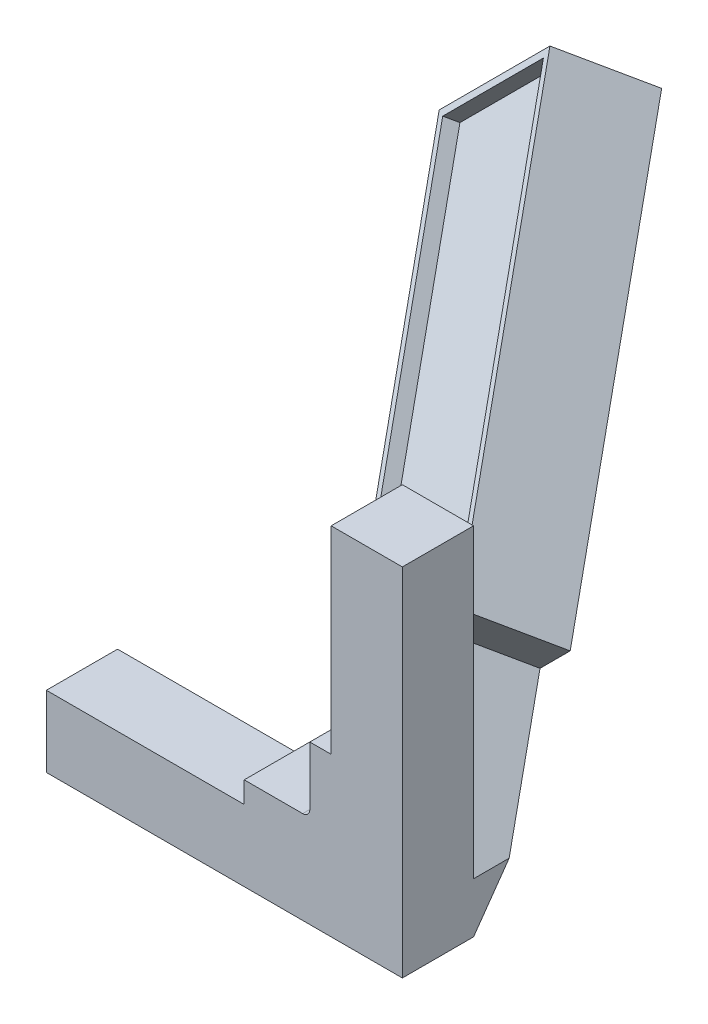
ISO-10303-21;
HEADER;
FILE_DESCRIPTION(('STEP AP214'),'2;1');
FILE_NAME('part.step','',(''),(''),'','','');
FILE_SCHEMA(('AUTOMOTIVE_DESIGN { 1 0 10303 214 1 1 1 1 }'));
ENDSEC;
DATA;
#1=APPLICATION_CONTEXT('core data for automotive mechanical design processes');
#2=APPLICATION_PROTOCOL_DEFINITION('international standard','automotive_design',2000,#1);
#3=PRODUCT_CONTEXT('',#1,'mechanical');
#4=PRODUCT('Part','Part','',(#3));
#5=PRODUCT_RELATED_PRODUCT_CATEGORY('part','',(#4));
#6=PRODUCT_DEFINITION_FORMATION('','',#4);
#7=PRODUCT_DEFINITION_CONTEXT('part definition',#1,'design');
#8=PRODUCT_DEFINITION('design','',#6,#7);
#9=PRODUCT_DEFINITION_SHAPE('','',#8);
#10=(LENGTH_UNIT() NAMED_UNIT(*) SI_UNIT(.MILLI.,.METRE.));
#11=(NAMED_UNIT(*) PLANE_ANGLE_UNIT() SI_UNIT($,.RADIAN.));
#12=(NAMED_UNIT(*) SI_UNIT($,.STERADIAN.) SOLID_ANGLE_UNIT());
#13=UNCERTAINTY_MEASURE_WITH_UNIT(LENGTH_MEASURE(1.E-05),#10,'distance_accuracy_value','');
#14=(GEOMETRIC_REPRESENTATION_CONTEXT(3) GLOBAL_UNCERTAINTY_ASSIGNED_CONTEXT((#13)) GLOBAL_UNIT_ASSIGNED_CONTEXT((#10,
#11,#12)) REPRESENTATION_CONTEXT('',''));
#15=CARTESIAN_POINT('',(0.,0.,0.));
#16=DIRECTION('',(0.,0.,1.));
#17=DIRECTION('',(1.,0.,0.));
#18=AXIS2_PLACEMENT_3D('',#15,#16,#17);
#19=CARTESIAN_POINT('',(12.0706341440673,-19.1417019559327,-15.6066017177982));
#20=DIRECTION('',(0.500000000000001,-0.500000000000001,-0.707106781186546));
#21=DIRECTION('',(-0.816496580927725,0.,-0.577350269189628));
#22=AXIS2_PLACEMENT_3D('',#19,#20,#21);
#23=PLANE('',#22);
#24=DIRECTION('',(0.816496580927725,0.,0.577350269189628));
#25=VECTOR('',#24,1.);
#26=CARTESIAN_POINT('',(-2.01198919124364,-23.10616805,-22.7612193161934));
#27=LINE('',#26,#25);
#28=CARTESIAN_POINT('',(16.0351002381345,-23.10616805,-10.));
#29=VERTEX_POINT('',#28);
#30=CARTESIAN_POINT('',(22.10616805,-23.10616805,-5.70710678118655));
#31=VERTEX_POINT('',#30);
#32=EDGE_CURVE('E314',#29,#31,#27,.T.);
#33=ORIENTED_EDGE('',*,*,#32,.T.);
#34=CARTESIAN_POINT('',(22.10616805,-22.10616805,-6.41421356237309));
#35=DIRECTION('',(0.500000000000001,-0.500000000000001,-0.707106781186546));
#36=DIRECTION('',(0.499999999999999,-0.499999999999999,0.707106781186549));
#37=AXIS2_PLACEMENT_3D('',#34,#35,#36);
#38=ELLIPSE('',#37,1.4142135623731,1.);
#39=CARTESIAN_POINT('',(23.10616805,-22.10616805,-5.70710678118654));
#40=VERTEX_POINT('',#39);
#41=EDGE_CURVE('E429',#31,#40,#38,.F.);
#42=ORIENTED_EDGE('',*,*,#41,.T.);
#43=DIRECTION('',(0.,0.816496580927725,-0.577350269189627));
#44=VECTOR('',#43,1.);
#45=CARTESIAN_POINT('',(23.10616805,-13.3921228420897,-11.8688672392661));
#46=LINE('',#45,#44);
#47=CARTESIAN_POINT('',(23.10616805,-16.0351002381345,-10.));
#48=VERTEX_POINT('',#47);
#49=EDGE_CURVE('E317',#40,#48,#46,.T.);
#50=ORIENTED_EDGE('',*,*,#49,.T.);
#51=DIRECTION('',(-0.499999999999999,0.499999999999999,-0.707106781186549));
#52=VECTOR('',#51,1.);
#53=CARTESIAN_POINT('',(19.1417019559328,-12.0706341440673,-15.6066017177982));
#54=LINE('',#53,#52);
#55=CARTESIAN_POINT('',(19.1417019559327,-12.0706341440673,-15.6066017177982));
#56=VERTEX_POINT('',#55);
#57=EDGE_CURVE('E328',#48,#56,#54,.T.);
#58=ORIENTED_EDGE('',*,*,#57,.T.);
#59=DIRECTION('',(0.707106781186547,0.707106781186548,0.));
#60=VECTOR('',#59,1.);
#61=CARTESIAN_POINT('',(15.60616805,-15.60616805,-15.6066017177982));
#62=LINE('',#61,#60);
#63=CARTESIAN_POINT('',(23.384342643052,-7.82799345694798,-15.6066017177982));
#64=VERTEX_POINT('',#63);
#65=EDGE_CURVE('E297',#56,#64,#62,.T.);
#66=ORIENTED_EDGE('',*,*,#65,.T.);
#67=DIRECTION('',(0.499999999999999,-0.499999999999999,0.707106781186549));
#68=VECTOR('',#67,1.);
#69=CARTESIAN_POINT('',(21.0990255710184,-5.54267638491439,-18.8385281153909));
#70=LINE('',#69,#68);
#71=CARTESIAN_POINT('',(-7.61565735694792,23.1720065430519,-59.4472221513643));
#72=VERTEX_POINT('',#71);
#73=EDGE_CURVE('E273',#72,#64,#70,.T.);
#74=ORIENTED_EDGE('',*,*,#73,.F.);
#75=DIRECTION('',(0.707106781186547,0.707106781186548,0.));
#76=VECTOR('',#75,1.);
#77=CARTESIAN_POINT('',(-15.3938319499999,15.3938319499999,-59.4472221513643));
#78=LINE('',#77,#76);
#79=CARTESIAN_POINT('',(-23.1720065430519,7.61565735694792,-59.4472221513643));
#80=VERTEX_POINT('',#79);
#81=EDGE_CURVE('E291',#80,#72,#78,.T.);
#82=ORIENTED_EDGE('',*,*,#81,.F.);
#83=DIRECTION('',(-0.499999999999999,0.499999999999999,-0.707106781186549));
#84=VECTOR('',#83,1.);
#85=CARTESIAN_POINT('',(5.5426763849144,-21.0990255710184,-18.8385281153909));
#86=LINE('',#85,#84);
#87=CARTESIAN_POINT('',(7.82799345694799,-23.384342643052,-15.6066017177982));
#88=VERTEX_POINT('',#87);
#89=EDGE_CURVE('E294',#88,#80,#86,.T.);
#90=ORIENTED_EDGE('',*,*,#89,.F.);
#91=CARTESIAN_POINT('',(12.0706341440673,-19.1417019559327,-15.6066017177982));
#92=VERTEX_POINT('',#91);
#93=EDGE_CURVE('E298',#88,#92,#62,.T.);
#94=ORIENTED_EDGE('',*,*,#93,.T.);
#95=DIRECTION('',(-0.499999999999999,0.499999999999999,-0.707106781186549));
#96=VECTOR('',#95,1.);
#97=CARTESIAN_POINT('',(12.0706341440673,-19.1417019559327,-15.6066017177982));
#98=LINE('',#97,#96);
#99=EDGE_CURVE('E333',#29,#92,#98,.T.);
#100=ORIENTED_EDGE('',*,*,#99,.F.);
#101=EDGE_LOOP('',(#33,#42,#50,#58,#66,#74,#82,#90,#94,#100));
#102=FACE_BOUND('',#101,.T.);
#103=DIRECTION('',(-0.5,0.499999999999999,-0.707106781186549));
#104=VECTOR('',#103,1.);
#105=CARTESIAN_POINT('',(6.24978316610096,-20.3919187898319,-18.8385281153909));
#106=LINE('',#105,#104);
#107=CARTESIAN_POINT('',(8.03510023813457,-22.1772358618655,-16.3137084989848));
#108=VERTEX_POINT('',#107);
#109=CARTESIAN_POINT('',(-21.9648997618654,7.82276413813443,-58.7401153701777));
#110=VERTEX_POINT('',#109);
#111=EDGE_CURVE('E86',#108,#110,#106,.T.);
#112=ORIENTED_EDGE('',*,*,#111,.T.);
#113=DIRECTION('',(0.707106781186547,0.707106781186548,0.));
#114=VECTOR('',#113,1.);
#115=CARTESIAN_POINT('',(-14.89383195,14.8938319499999,-58.7401153701777));
#116=LINE('',#115,#114);
#117=CARTESIAN_POINT('',(-7.82276413813445,21.9648997618654,-58.7401153701777));
#118=VERTEX_POINT('',#117);
#119=EDGE_CURVE('E258',#110,#118,#116,.T.);
#120=ORIENTED_EDGE('',*,*,#119,.T.);
#121=DIRECTION('',(0.499999999999999,-0.499999999999999,0.707106781186549));
#122=VECTOR('',#121,1.);
#123=CARTESIAN_POINT('',(20.3919187898319,-6.24978316610092,-18.8385281153909));
#124=LINE('',#123,#122);
#125=CARTESIAN_POINT('',(22.1772358618655,-8.03510023813451,-16.3137084989848));
#126=VERTEX_POINT('',#125);
#127=EDGE_CURVE('E261',#118,#126,#124,.T.);
#128=ORIENTED_EDGE('',*,*,#127,.T.);
#129=DIRECTION('',(-0.707106781186547,-0.707106781186548,0.));
#130=VECTOR('',#129,1.);
#131=CARTESIAN_POINT('',(15.10616805,-15.10616805,-16.3137084989848));
#132=LINE('',#131,#130);
#133=EDGE_CURVE('E267',#126,#108,#132,.T.);
#134=ORIENTED_EDGE('',*,*,#133,.T.);
#135=EDGE_LOOP('',(#112,#120,#128,#134));
#136=FACE_BOUND('',#135,.T.);
#137=ADVANCED_FACE('F71',(#102,#136),#23,.F.);
#138=CARTESIAN_POINT('',(0.,0.,-5.));
#139=DIRECTION('',(0.,0.,1.));
#140=DIRECTION('',(1.,0.,0.));
#141=AXIS2_PLACEMENT_3D('',#138,#139,#140);
#142=PLANE('',#141);
#143=DIRECTION('',(-1.,0.,0.));
#144=VECTOR('',#143,1.);
#145=CARTESIAN_POINT('',(0.,-23.10616805,-5.));
#146=LINE('',#145,#144);
#147=CARTESIAN_POINT('',(16.0351002381345,-23.10616805,-5.));
#148=VERTEX_POINT('',#147);
#149=CARTESIAN_POINT('',(13.89571718,-23.10616805,-5.));
#150=VERTEX_POINT('',#149);
#151=EDGE_CURVE('E381',#148,#150,#146,.T.);
#152=ORIENTED_EDGE('',*,*,#151,.F.);
#153=DIRECTION('',(-0.707106781186548,0.707106781186547,0.));
#154=VECTOR('',#153,1.);
#155=CARTESIAN_POINT('',(32.5687489140673,-39.6398167259327,-5.));
#156=LINE('',#155,#154);
#157=CARTESIAN_POINT('',(29.0332150081345,-36.10428282,-5.));
#158=VERTEX_POINT('',#157);
#159=EDGE_CURVE('E329',#158,#148,#156,.T.);
#160=ORIENTED_EDGE('',*,*,#159,.F.);
#161=DIRECTION('',(-1.,0.,0.));
#162=VECTOR('',#161,1.);
#163=CARTESIAN_POINT('',(0.,-36.10428282,-5.));
#164=LINE('',#163,#162);
#165=CARTESIAN_POINT('',(-13.89571718,-36.10428282,-5.));
#166=VERTEX_POINT('',#165);
#167=EDGE_CURVE('E392',#158,#166,#164,.T.);
#168=ORIENTED_EDGE('',*,*,#167,.T.);
#169=DIRECTION('',(0.,-1.,0.));
#170=VECTOR('',#169,1.);
#171=CARTESIAN_POINT('',(-13.89571718,0.,-5.));
#172=LINE('',#171,#170);
#173=CARTESIAN_POINT('',(-13.89571718,-26.10428282,-5.));
#174=VERTEX_POINT('',#173);
#175=EDGE_CURVE('E389',#174,#166,#172,.T.);
#176=ORIENTED_EDGE('',*,*,#175,.F.);
#177=DIRECTION('',(1.,0.,0.));
#178=VECTOR('',#177,1.);
#179=CARTESIAN_POINT('',(0.,-26.10428282,-5.));
#180=LINE('',#179,#178);
#181=CARTESIAN_POINT('',(13.89571718,-26.10428282,-5.));
#182=VERTEX_POINT('',#181);
#183=EDGE_CURVE('E386',#174,#182,#180,.T.);
#184=ORIENTED_EDGE('',*,*,#183,.T.);
#185=DIRECTION('',(0.,1.,0.));
#186=VECTOR('',#185,1.);
#187=CARTESIAN_POINT('',(13.89571718,0.,-5.));
#188=LINE('',#187,#186);
#189=EDGE_CURVE('E383',#182,#150,#188,.T.);
#190=ORIENTED_EDGE('',*,*,#189,.T.);
#191=EDGE_LOOP('',(#152,#160,#168,#176,#184,#190));
#192=FACE_BOUND('',#191,.T.);
#193=ADVANCED_FACE('F517',(#192),#142,.F.);
#194=DIRECTION('',(-0.707106781186548,0.707106781186547,0.));
#195=VECTOR('',#194,1.);
#196=CARTESIAN_POINT('',(39.6398167259327,-32.5687489140672,-5.));
#197=LINE('',#196,#195);
#198=CARTESIAN_POINT('',(36.10428282,-29.0332150081345,-5.));
#199=VERTEX_POINT('',#198);
#200=CARTESIAN_POINT('',(23.10616805,-16.0351002381345,-5.));
#201=VERTEX_POINT('',#200);
#202=EDGE_CURVE('E331',#199,#201,#197,.T.);
#203=ORIENTED_EDGE('',*,*,#202,.T.);
#204=DIRECTION('',(0.,-1.,0.));
#205=VECTOR('',#204,1.);
#206=CARTESIAN_POINT('',(23.10616805,0.,-5.));
#207=LINE('',#206,#205);
#208=CARTESIAN_POINT('',(23.10616805,-13.89571718,-5.));
#209=VERTEX_POINT('',#208);
#210=EDGE_CURVE('E343',#209,#201,#207,.T.);
#211=ORIENTED_EDGE('',*,*,#210,.F.);
#212=DIRECTION('',(-1.,0.,0.));
#213=VECTOR('',#212,1.);
#214=CARTESIAN_POINT('',(0.,-13.89571718,-5.));
#215=LINE('',#214,#213);
#216=CARTESIAN_POINT('',(26.10428282,-13.89571718,-5.));
#217=VERTEX_POINT('',#216);
#218=EDGE_CURVE('E355',#217,#209,#215,.T.);
#219=ORIENTED_EDGE('',*,*,#218,.F.);
#220=DIRECTION('',(0.,-1.,0.));
#221=VECTOR('',#220,1.);
#222=CARTESIAN_POINT('',(26.10428282,0.,-5.));
#223=LINE('',#222,#221);
#224=CARTESIAN_POINT('',(26.10428282,13.89571718,-5.));
#225=VERTEX_POINT('',#224);
#226=EDGE_CURVE('E400',#225,#217,#223,.T.);
#227=ORIENTED_EDGE('',*,*,#226,.F.);
#228=DIRECTION('',(1.,0.,0.));
#229=VECTOR('',#228,1.);
#230=CARTESIAN_POINT('',(0.,13.89571718,-5.));
#231=LINE('',#230,#229);
#232=CARTESIAN_POINT('',(36.10428282,13.89571718,-5.));
#233=VERTEX_POINT('',#232);
#234=EDGE_CURVE('E397',#225,#233,#231,.T.);
#235=ORIENTED_EDGE('',*,*,#234,.T.);
#236=DIRECTION('',(0.,-1.,0.));
#237=VECTOR('',#236,1.);
#238=CARTESIAN_POINT('',(36.10428282,0.,-5.));
#239=LINE('',#238,#237);
#240=EDGE_CURVE('E394',#233,#199,#239,.T.);
#241=ORIENTED_EDGE('',*,*,#240,.T.);
#242=EDGE_LOOP('',(#203,#211,#219,#227,#235,#241));
#243=FACE_BOUND('',#242,.T.);
#244=ADVANCED_FACE('F483',(#243),#142,.F.);
#245=CARTESIAN_POINT('',(23.10616805,0.,5.));
#246=DIRECTION('',(1.,0.,0.));
#247=DIRECTION('',(0.,0.,-1.));
#248=AXIS2_PLACEMENT_3D('',#245,#246,#247);
#249=PLANE('',#248);
#250=ORIENTED_EDGE('',*,*,#49,.F.);
#251=DIRECTION('',(0.,0.,-1.));
#252=VECTOR('',#251,1.);
#253=CARTESIAN_POINT('',(23.10616805,-22.10616805,5.));
#254=LINE('',#253,#252);
#255=CARTESIAN_POINT('',(23.10616805,-22.10616805,5.));
#256=VERTEX_POINT('',#255);
#257=EDGE_CURVE('E79',#40,#256,#254,.F.);
#258=ORIENTED_EDGE('',*,*,#257,.T.);
#259=DIRECTION('',(0.,-1.,0.));
#260=VECTOR('',#259,1.);
#261=CARTESIAN_POINT('',(23.10616805,0.,5.));
#262=LINE('',#261,#260);
#263=CARTESIAN_POINT('',(23.10616805,-13.89571718,5.));
#264=VERTEX_POINT('',#263);
#265=EDGE_CURVE('E352',#264,#256,#262,.T.);
#266=ORIENTED_EDGE('',*,*,#265,.F.);
#267=DIRECTION('',(0.,0.,-1.));
#268=VECTOR('',#267,1.);
#269=CARTESIAN_POINT('',(23.10616805,-13.89571718,5.));
#270=LINE('',#269,#268);
#271=EDGE_CURVE('E378',#264,#209,#270,.T.);
#272=ORIENTED_EDGE('',*,*,#271,.T.);
#273=ORIENTED_EDGE('',*,*,#210,.T.);
#274=DIRECTION('',(0.,0.,1.));
#275=VECTOR('',#274,1.);
#276=CARTESIAN_POINT('',(23.10616805,-16.0351002381345,-25.6066017177982));
#277=LINE('',#276,#275);
#278=EDGE_CURVE('E319',#48,#201,#277,.T.);
#279=ORIENTED_EDGE('',*,*,#278,.F.);
#280=EDGE_LOOP('',(#250,#258,#266,#272,#273,#279));
#281=FACE_BOUND('',#280,.T.);
#282=ADVANCED_FACE('F438',(#281),#249,.F.);
#283=CARTESIAN_POINT('',(0.,-23.10616805,5.));
#284=DIRECTION('',(0.,-1.,0.));
#285=DIRECTION('',(0.,0.,-1.));
#286=AXIS2_PLACEMENT_3D('',#283,#284,#285);
#287=PLANE('',#286);
#288=DIRECTION('',(-1.,0.,0.));
#289=VECTOR('',#288,1.);
#290=CARTESIAN_POINT('',(0.,-23.10616805,5.));
#291=LINE('',#290,#289);
#292=CARTESIAN_POINT('',(22.10616805,-23.10616805,5.));
#293=VERTEX_POINT('',#292);
#294=CARTESIAN_POINT('',(13.89571718,-23.10616805,5.));
#295=VERTEX_POINT('',#294);
#296=EDGE_CURVE('E354',#293,#295,#291,.T.);
#297=ORIENTED_EDGE('',*,*,#296,.F.);
#298=DIRECTION('',(0.,0.,-1.));
#299=VECTOR('',#298,1.);
#300=CARTESIAN_POINT('',(22.10616805,-23.10616805,-5.));
#301=LINE('',#300,#299);
#302=EDGE_CURVE('E426',#293,#31,#301,.T.);
#303=ORIENTED_EDGE('',*,*,#302,.T.);
#304=ORIENTED_EDGE('',*,*,#32,.F.);
#305=DIRECTION('',(0.,0.,1.));
#306=VECTOR('',#305,1.);
#307=CARTESIAN_POINT('',(16.0351002381345,-23.10616805,-25.6066017177982));
#308=LINE('',#307,#306);
#309=EDGE_CURVE('E288',#29,#148,#308,.T.);
#310=ORIENTED_EDGE('',*,*,#309,.T.);
#311=ORIENTED_EDGE('',*,*,#151,.T.);
#312=DIRECTION('',(0.,0.,-1.));
#313=VECTOR('',#312,1.);
#314=CARTESIAN_POINT('',(13.89571718,-23.10616805,5.));
#315=LINE('',#314,#313);
#316=EDGE_CURVE('E332',#295,#150,#315,.T.);
#317=ORIENTED_EDGE('',*,*,#316,.F.);
#318=EDGE_LOOP('',(#297,#303,#304,#310,#311,#317));
#319=FACE_BOUND('',#318,.T.);
#320=ADVANCED_FACE('F446',(#319),#287,.F.);
#321=CARTESIAN_POINT('',(13.89571718,0.,5.));
#322=DIRECTION('',(-1.,0.,0.));
#323=DIRECTION('',(0.,0.,1.));
#324=AXIS2_PLACEMENT_3D('',#321,#322,#323);
#325=PLANE('',#324);
#326=ORIENTED_EDGE('',*,*,#189,.F.);
#327=DIRECTION('',(0.,0.,-1.));
#328=VECTOR('',#327,1.);
#329=CARTESIAN_POINT('',(13.89571718,-26.10428282,5.));
#330=LINE('',#329,#328);
#331=CARTESIAN_POINT('',(13.89571718,-26.10428282,5.));
#332=VERTEX_POINT('',#331);
#333=EDGE_CURVE('E419',#332,#182,#330,.T.);
#334=ORIENTED_EDGE('',*,*,#333,.F.);
#335=DIRECTION('',(0.,1.,0.));
#336=VECTOR('',#335,1.);
#337=CARTESIAN_POINT('',(13.89571718,0.,5.));
#338=LINE('',#337,#336);
#339=EDGE_CURVE('E357',#332,#295,#338,.T.);
#340=ORIENTED_EDGE('',*,*,#339,.T.);
#341=ORIENTED_EDGE('',*,*,#316,.T.);
#342=EDGE_LOOP('',(#326,#334,#340,#341));
#343=FACE_BOUND('',#342,.T.);
#344=ADVANCED_FACE('F450',(#343),#325,.T.);
#345=CARTESIAN_POINT('',(0.,-26.10428282,5.));
#346=DIRECTION('',(0.,1.,0.));
#347=DIRECTION('',(0.,0.,1.));
#348=AXIS2_PLACEMENT_3D('',#345,#346,#347);
#349=PLANE('',#348);
#350=ORIENTED_EDGE('',*,*,#183,.F.);
#351=DIRECTION('',(0.,0.,-1.));
#352=VECTOR('',#351,1.);
#353=CARTESIAN_POINT('',(-13.89571718,-26.10428282,5.));
#354=LINE('',#353,#352);
#355=CARTESIAN_POINT('',(-13.89571718,-26.10428282,5.));
#356=VERTEX_POINT('',#355);
#357=EDGE_CURVE('E417',#356,#174,#354,.T.);
#358=ORIENTED_EDGE('',*,*,#357,.F.);
#359=DIRECTION('',(1.,0.,0.));
#360=VECTOR('',#359,1.);
#361=CARTESIAN_POINT('',(0.,-26.10428282,5.));
#362=LINE('',#361,#360);
#363=EDGE_CURVE('E360',#356,#332,#362,.T.);
#364=ORIENTED_EDGE('',*,*,#363,.T.);
#365=ORIENTED_EDGE('',*,*,#333,.T.);
#366=EDGE_LOOP('',(#350,#358,#364,#365));
#367=FACE_BOUND('',#366,.T.);
#368=ADVANCED_FACE('F454',(#367),#349,.T.);
#369=CARTESIAN_POINT('',(-13.89571718,0.,5.));
#370=DIRECTION('',(1.,0.,0.));
#371=DIRECTION('',(0.,0.,-1.));
#372=AXIS2_PLACEMENT_3D('',#369,#370,#371);
#373=PLANE('',#372);
#374=ORIENTED_EDGE('',*,*,#175,.T.);
#375=DIRECTION('',(0.,0.,-1.));
#376=VECTOR('',#375,1.);
#377=CARTESIAN_POINT('',(-13.89571718,-36.10428282,5.));
#378=LINE('',#377,#376);
#379=CARTESIAN_POINT('',(-13.89571718,-36.10428282,5.));
#380=VERTEX_POINT('',#379);
#381=EDGE_CURVE('E414',#380,#166,#378,.T.);
#382=ORIENTED_EDGE('',*,*,#381,.F.);
#383=DIRECTION('',(0.,-1.,0.));
#384=VECTOR('',#383,1.);
#385=CARTESIAN_POINT('',(-13.89571718,0.,5.));
#386=LINE('',#385,#384);
#387=EDGE_CURVE('E363',#356,#380,#386,.T.);
#388=ORIENTED_EDGE('',*,*,#387,.F.);
#389=ORIENTED_EDGE('',*,*,#357,.T.);
#390=EDGE_LOOP('',(#374,#382,#388,#389));
#391=FACE_BOUND('',#390,.T.);
#392=ADVANCED_FACE('F459',(#391),#373,.F.);
#393=CARTESIAN_POINT('',(0.,-36.10428282,5.));
#394=DIRECTION('',(0.,-1.,0.));
#395=DIRECTION('',(0.,0.,-1.));
#396=AXIS2_PLACEMENT_3D('',#393,#394,#395);
#397=PLANE('',#396);
#398=ORIENTED_EDGE('',*,*,#167,.F.);
#399=DIRECTION('',(0.,0.,1.));
#400=VECTOR('',#399,1.);
#401=CARTESIAN_POINT('',(29.0332150081345,-36.10428282,0.));
#402=LINE('',#401,#400);
#403=CARTESIAN_POINT('',(29.0332150081345,-36.10428282,-10.));
#404=VERTEX_POINT('',#403);
#405=EDGE_CURVE('E424',#404,#158,#402,.T.);
#406=ORIENTED_EDGE('',*,*,#405,.F.);
#407=DIRECTION('',(-0.816496580927724,0.,-0.577350269189628));
#408=VECTOR('',#407,1.);
#409=CARTESIAN_POINT('',(33.7472602160448,-36.10428282,-6.66666666666666));
#410=LINE('',#409,#408);
#411=CARTESIAN_POINT('',(36.10428282,-36.10428282,-4.99999999999999));
#412=VERTEX_POINT('',#411);
#413=EDGE_CURVE('E325',#412,#404,#410,.T.);
#414=ORIENTED_EDGE('',*,*,#413,.F.);
#415=DIRECTION('',(0.,0.,-1.));
#416=VECTOR('',#415,1.);
#417=CARTESIAN_POINT('',(36.10428282,-36.10428282,5.));
#418=LINE('',#417,#416);
#419=CARTESIAN_POINT('',(36.10428282,-36.10428282,5.));
#420=VERTEX_POINT('',#419);
#421=EDGE_CURVE('E412',#420,#412,#418,.T.);
#422=ORIENTED_EDGE('',*,*,#421,.F.);
#423=DIRECTION('',(-1.,0.,0.));
#424=VECTOR('',#423,1.);
#425=CARTESIAN_POINT('',(0.,-36.10428282,5.));
#426=LINE('',#425,#424);
#427=EDGE_CURVE('E365',#420,#380,#426,.T.);
#428=ORIENTED_EDGE('',*,*,#427,.T.);
#429=ORIENTED_EDGE('',*,*,#381,.T.);
#430=EDGE_LOOP('',(#398,#406,#414,#422,#428,#429));
#431=FACE_BOUND('',#430,.T.);
#432=ADVANCED_FACE('F514',(#431),#397,.T.);
#433=CARTESIAN_POINT('',(36.10428282,0.,5.));
#434=DIRECTION('',(1.,0.,0.));
#435=DIRECTION('',(0.,0.,-1.));
#436=AXIS2_PLACEMENT_3D('',#433,#434,#435);
#437=PLANE('',#436);
#438=DIRECTION('',(0.,0.,1.));
#439=VECTOR('',#438,1.);
#440=CARTESIAN_POINT('',(36.10428282,-29.0332150081345,0.));
#441=LINE('',#440,#439);
#442=CARTESIAN_POINT('',(36.10428282,-29.0332150081345,-10.));
#443=VERTEX_POINT('',#442);
#444=EDGE_CURVE('E345',#443,#199,#441,.T.);
#445=ORIENTED_EDGE('',*,*,#444,.T.);
#446=ORIENTED_EDGE('',*,*,#240,.F.);
#447=DIRECTION('',(0.,0.,-1.));
#448=VECTOR('',#447,1.);
#449=CARTESIAN_POINT('',(36.10428282,13.89571718,5.));
#450=LINE('',#449,#448);
#451=CARTESIAN_POINT('',(36.10428282,13.89571718,5.));
#452=VERTEX_POINT('',#451);
#453=EDGE_CURVE('E410',#452,#233,#450,.T.);
#454=ORIENTED_EDGE('',*,*,#453,.F.);
#455=DIRECTION('',(0.,-1.,0.));
#456=VECTOR('',#455,1.);
#457=CARTESIAN_POINT('',(36.10428282,0.,5.));
#458=LINE('',#457,#456);
#459=EDGE_CURVE('E368',#452,#420,#458,.T.);
#460=ORIENTED_EDGE('',*,*,#459,.T.);
#461=ORIENTED_EDGE('',*,*,#421,.T.);
#462=DIRECTION('',(0.,-0.816496580927725,0.577350269189628));
#463=VECTOR('',#462,1.);
#464=CARTESIAN_POINT('',(36.10428282,-38.4613054239551,-3.33333333333333));
#465=LINE('',#464,#463);
#466=EDGE_CURVE('E322',#443,#412,#465,.T.);
#467=ORIENTED_EDGE('',*,*,#466,.F.);
#468=EDGE_LOOP('',(#445,#446,#454,#460,#461,#467));
#469=FACE_BOUND('',#468,.T.);
#470=ADVANCED_FACE('F465',(#469),#437,.T.);
#471=CARTESIAN_POINT('',(0.,13.89571718,5.));
#472=DIRECTION('',(0.,1.,0.));
#473=DIRECTION('',(0.,0.,1.));
#474=AXIS2_PLACEMENT_3D('',#471,#472,#473);
#475=PLANE('',#474);
#476=ORIENTED_EDGE('',*,*,#234,.F.);
#477=DIRECTION('',(0.,0.,-1.));
#478=VECTOR('',#477,1.);
#479=CARTESIAN_POINT('',(26.10428282,13.89571718,5.));
#480=LINE('',#479,#478);
#481=CARTESIAN_POINT('',(26.10428282,13.89571718,5.));
#482=VERTEX_POINT('',#481);
#483=EDGE_CURVE('E408',#482,#225,#480,.T.);
#484=ORIENTED_EDGE('',*,*,#483,.F.);
#485=DIRECTION('',(1.,0.,0.));
#486=VECTOR('',#485,1.);
#487=CARTESIAN_POINT('',(0.,13.89571718,5.));
#488=LINE('',#487,#486);
#489=EDGE_CURVE('E371',#482,#452,#488,.T.);
#490=ORIENTED_EDGE('',*,*,#489,.T.);
#491=ORIENTED_EDGE('',*,*,#453,.T.);
#492=EDGE_LOOP('',(#476,#484,#490,#491));
#493=FACE_BOUND('',#492,.T.);
#494=ADVANCED_FACE('F470',(#493),#475,.T.);
#495=CARTESIAN_POINT('',(26.10428282,0.,5.));
#496=DIRECTION('',(1.,0.,0.));
#497=DIRECTION('',(0.,0.,-1.));
#498=AXIS2_PLACEMENT_3D('',#495,#496,#497);
#499=PLANE('',#498);
#500=ORIENTED_EDGE('',*,*,#226,.T.);
#501=DIRECTION('',(0.,0.,-1.));
#502=VECTOR('',#501,1.);
#503=CARTESIAN_POINT('',(26.10428282,-13.89571718,5.));
#504=LINE('',#503,#502);
#505=CARTESIAN_POINT('',(26.10428282,-13.89571718,5.));
#506=VERTEX_POINT('',#505);
#507=EDGE_CURVE('E405',#506,#217,#504,.T.);
#508=ORIENTED_EDGE('',*,*,#507,.F.);
#509=DIRECTION('',(0.,-1.,0.));
#510=VECTOR('',#509,1.);
#511=CARTESIAN_POINT('',(26.10428282,0.,5.));
#512=LINE('',#511,#510);
#513=EDGE_CURVE('E374',#482,#506,#512,.T.);
#514=ORIENTED_EDGE('',*,*,#513,.F.);
#515=ORIENTED_EDGE('',*,*,#483,.T.);
#516=EDGE_LOOP('',(#500,#508,#514,#515));
#517=FACE_BOUND('',#516,.T.);
#518=ADVANCED_FACE('F476',(#517),#499,.F.);
#519=CARTESIAN_POINT('',(0.,-13.89571718,5.));
#520=DIRECTION('',(0.,-1.,0.));
#521=DIRECTION('',(0.,0.,-1.));
#522=AXIS2_PLACEMENT_3D('',#519,#520,#521);
#523=PLANE('',#522);
#524=ORIENTED_EDGE('',*,*,#218,.T.);
#525=ORIENTED_EDGE('',*,*,#271,.F.);
#526=DIRECTION('',(-1.,0.,0.));
#527=VECTOR('',#526,1.);
#528=CARTESIAN_POINT('',(0.,-13.89571718,5.));
#529=LINE('',#528,#527);
#530=EDGE_CURVE('E376',#506,#264,#529,.T.);
#531=ORIENTED_EDGE('',*,*,#530,.F.);
#532=ORIENTED_EDGE('',*,*,#507,.T.);
#533=EDGE_LOOP('',(#524,#525,#531,#532));
#534=FACE_BOUND('',#533,.T.);
#535=ADVANCED_FACE('F480',(#534),#523,.F.);
#536=CARTESIAN_POINT('',(0.,0.,5.));
#537=DIRECTION('',(0.,0.,1.));
#538=DIRECTION('',(1.,0.,0.));
#539=AXIS2_PLACEMENT_3D('',#536,#537,#538);
#540=PLANE('',#539);
#541=ORIENTED_EDGE('',*,*,#265,.T.);
#542=CARTESIAN_POINT('',(22.10616805,-22.10616805,5.));
#543=DIRECTION('',(0.,0.,1.));
#544=DIRECTION('',(1.,0.,0.));
#545=AXIS2_PLACEMENT_3D('',#542,#543,#544);
#546=CIRCLE('',#545,1.);
#547=EDGE_CURVE('E12',#256,#293,#546,.F.);
#548=ORIENTED_EDGE('',*,*,#547,.T.);
#549=ORIENTED_EDGE('',*,*,#296,.T.);
#550=ORIENTED_EDGE('',*,*,#339,.F.);
#551=ORIENTED_EDGE('',*,*,#363,.F.);
#552=ORIENTED_EDGE('',*,*,#387,.T.);
#553=ORIENTED_EDGE('',*,*,#427,.F.);
#554=ORIENTED_EDGE('',*,*,#459,.F.);
#555=ORIENTED_EDGE('',*,*,#489,.F.);
#556=ORIENTED_EDGE('',*,*,#513,.T.);
#557=ORIENTED_EDGE('',*,*,#530,.T.);
#558=EDGE_LOOP('',(#541,#548,#549,#550,#551,#552,#553,#554,#555,#556,#557));
#559=FACE_BOUND('',#558,.T.);
#560=ADVANCED_FACE('F442',(#559),#540,.T.);
#561=CARTESIAN_POINT('',(32.5687489140673,-39.6398167259327,-5.));
#562=DIRECTION('',(-0.500000000000001,0.500000000000001,0.707106781186546));
#563=DIRECTION('',(0.816496580927724,0.,0.577350269189628));
#564=AXIS2_PLACEMENT_3D('',#561,#562,#563);
#565=PLANE('',#564);
#566=ORIENTED_EDGE('',*,*,#466,.T.);
#567=ORIENTED_EDGE('',*,*,#413,.T.);
#568=DIRECTION('',(0.499999999999999,-0.499999999999999,0.707106781186549));
#569=VECTOR('',#568,1.);
#570=CARTESIAN_POINT('',(32.5687489140673,-39.6398167259327,-5.));
#571=LINE('',#570,#569);
#572=CARTESIAN_POINT('',(18.5696915290673,-25.6407593409328,-24.7976568143063));
#573=VERTEX_POINT('',#572);
#574=EDGE_CURVE('E340',#573,#404,#571,.T.);
#575=ORIENTED_EDGE('',*,*,#574,.F.);
#576=DIRECTION('',(-0.707106781186547,-0.707106781186548,0.));
#577=VECTOR('',#576,1.);
#578=CARTESIAN_POINT('',(22.1052254350001,-22.105225435,-24.7976568143063));
#579=LINE('',#578,#577);
#580=CARTESIAN_POINT('',(14.327050841948,-29.8834000280521,-24.7976568143063));
#581=VERTEX_POINT('',#580);
#582=EDGE_CURVE('E280',#573,#581,#579,.T.);
#583=ORIENTED_EDGE('',*,*,#582,.T.);
#584=DIRECTION('',(0.499999999999999,-0.499999999999999,0.707106781186549));
#585=VECTOR('',#584,1.);
#586=CARTESIAN_POINT('',(12.0417337699144,-27.5980829560184,-28.029583211899));
#587=LINE('',#586,#585);
#588=CARTESIAN_POINT('',(-16.6729491580519,1.11659997194786,-68.6382772478723));
#589=VERTEX_POINT('',#588);
#590=EDGE_CURVE('E277',#589,#581,#587,.T.);
#591=ORIENTED_EDGE('',*,*,#590,.F.);
#592=DIRECTION('',(-0.707106781186547,-0.707106781186548,0.));
#593=VECTOR('',#592,1.);
#594=CARTESIAN_POINT('',(-8.89477456499986,8.89477456499988,-68.6382772478723));
#595=LINE('',#594,#593);
#596=CARTESIAN_POINT('',(-1.11659997194785,16.6729491580519,-68.6382772478723));
#597=VERTEX_POINT('',#596);
#598=EDGE_CURVE('E281',#597,#589,#595,.T.);
#599=ORIENTED_EDGE('',*,*,#598,.F.);
#600=DIRECTION('',(-0.499999999999999,0.499999999999999,-0.707106781186549));
#601=VECTOR('',#600,1.);
#602=CARTESIAN_POINT('',(27.5980829560185,-12.0417337699144,-28.029583211899));
#603=LINE('',#602,#601);
#604=CARTESIAN_POINT('',(29.8834000280521,-14.327050841948,-24.7976568143063));
#605=VERTEX_POINT('',#604);
#606=EDGE_CURVE('E285',#605,#597,#603,.T.);
#607=ORIENTED_EDGE('',*,*,#606,.F.);
#608=CARTESIAN_POINT('',(25.6407593409328,-18.5696915290673,-24.7976568143063));
#609=VERTEX_POINT('',#608);
#610=EDGE_CURVE('E282',#605,#609,#579,.T.);
#611=ORIENTED_EDGE('',*,*,#610,.T.);
#612=DIRECTION('',(0.499999999999999,-0.499999999999999,0.707106781186549));
#613=VECTOR('',#612,1.);
#614=CARTESIAN_POINT('',(39.6398167259327,-32.5687489140672,-5.));
#615=LINE('',#614,#613);
#616=EDGE_CURVE('E337',#609,#443,#615,.T.);
#617=ORIENTED_EDGE('',*,*,#616,.T.);
#618=EDGE_LOOP('',(#566,#567,#575,#583,#591,#599,#607,#611,#617));
#619=FACE_BOUND('',#618,.T.);
#620=ADVANCED_FACE('F512',(#619),#565,.F.);
#621=CARTESIAN_POINT('',(-3.53553390593274,-3.53553390593274,0.));
#622=DIRECTION('',(0.707106781186547,0.707106781186548,0.));
#623=DIRECTION('',(-0.707106781186548,0.707106781186547,0.));
#624=AXIS2_PLACEMENT_3D('',#621,#622,#623);
#625=PLANE('',#624);
#626=ORIENTED_EDGE('',*,*,#574,.T.);
#627=ORIENTED_EDGE('',*,*,#405,.T.);
#628=ORIENTED_EDGE('',*,*,#159,.T.);
#629=ORIENTED_EDGE('',*,*,#309,.F.);
#630=ORIENTED_EDGE('',*,*,#99,.T.);
#631=DIRECTION('',(0.500000000000001,-0.500000000000001,-0.707106781186546));
#632=VECTOR('',#631,1.);
#633=CARTESIAN_POINT('',(18.5696915290673,-25.6407593409328,-24.7976568143063));
#634=LINE('',#633,#632);
#635=EDGE_CURVE('E336',#92,#573,#634,.T.);
#636=ORIENTED_EDGE('',*,*,#635,.T.);
#637=EDGE_LOOP('',(#626,#627,#628,#629,#630,#636));
#638=FACE_BOUND('',#637,.T.);
#639=ADVANCED_FACE('F510',(#638),#625,.F.);
#640=CARTESIAN_POINT('',(3.53553390593273,3.53553390593273,0.));
#641=DIRECTION('',(0.707106781186547,0.707106781186548,0.));
#642=DIRECTION('',(-0.707106781186548,0.707106781186547,0.));
#643=AXIS2_PLACEMENT_3D('',#640,#641,#642);
#644=PLANE('',#643);
#645=ORIENTED_EDGE('',*,*,#444,.F.);
#646=ORIENTED_EDGE('',*,*,#616,.F.);
#647=DIRECTION('',(0.500000000000001,-0.500000000000001,-0.707106781186546));
#648=VECTOR('',#647,1.);
#649=CARTESIAN_POINT('',(25.6407593409328,-18.5696915290673,-24.7976568143063));
#650=LINE('',#649,#648);
#651=EDGE_CURVE('E348',#56,#609,#650,.T.);
#652=ORIENTED_EDGE('',*,*,#651,.F.);
#653=ORIENTED_EDGE('',*,*,#57,.F.);
#654=ORIENTED_EDGE('',*,*,#278,.T.);
#655=ORIENTED_EDGE('',*,*,#202,.F.);
#656=EDGE_LOOP('',(#645,#646,#652,#653,#654,#655));
#657=FACE_BOUND('',#656,.T.);
#658=ADVANCED_FACE('F487',(#657),#644,.T.);
#659=CARTESIAN_POINT('',(22.10616805,-22.10616805,5.));
#660=DIRECTION('',(0.,0.,1.));
#661=DIRECTION('',(1.,0.,0.));
#662=AXIS2_PLACEMENT_3D('',#659,#660,#661);
#663=CYLINDRICAL_SURFACE('',#662,1.);
#664=ORIENTED_EDGE('',*,*,#547,.F.);
#665=ORIENTED_EDGE('',*,*,#257,.F.);
#666=ORIENTED_EDGE('',*,*,#41,.F.);
#667=ORIENTED_EDGE('',*,*,#302,.F.);
#668=EDGE_LOOP('',(#664,#665,#666,#667));
#669=FACE_BOUND('',#668,.T.);
#670=ADVANCED_FACE('F73',(#669),#663,.F.);
#671=CARTESIAN_POINT('',(61.6557857947375,-61.6557857947374,-80.7305956745024));
#672=DIRECTION('',(0.499999999999999,-0.499999999999999,0.707106781186549));
#673=DIRECTION('',(0.816496580927727,0.,-0.577350269189624));
#674=AXIS2_PLACEMENT_3D('',#671,#672,#673);
#675=PLANE('',#674);
#676=ORIENTED_EDGE('',*,*,#635,.F.);
#677=ORIENTED_EDGE('',*,*,#93,.F.);
#678=DIRECTION('',(-0.500000000000001,0.500000000000001,0.707106781186546));
#679=VECTOR('',#678,1.);
#680=CARTESIAN_POINT('',(53.8776112016855,-69.4339603877895,-80.7305956745024));
#681=LINE('',#680,#679);
#682=EDGE_CURVE('E305',#581,#88,#681,.T.);
#683=ORIENTED_EDGE('',*,*,#682,.F.);
#684=ORIENTED_EDGE('',*,*,#582,.F.);
#685=EDGE_LOOP('',(#676,#677,#683,#684));
#686=FACE_BOUND('',#685,.T.);
#687=ADVANCED_FACE('F507',(#686),#675,.T.);
#688=CARTESIAN_POINT('',(30.6557857947375,-30.6557857947375,-124.571216108068));
#689=DIRECTION('',(0.499999999999999,-0.499999999999999,0.707106781186549));
#690=DIRECTION('',(0.816496580927727,0.,-0.577350269189624));
#691=AXIS2_PLACEMENT_3D('',#688,#689,#690);
#692=PLANE('',#691);
#693=DIRECTION('',(-0.500000000000001,0.500000000000001,0.707106781186546));
#694=VECTOR('',#693,1.);
#695=CARTESIAN_POINT('',(38.4339603877895,-22.8776112016855,-124.571216108068));
#696=LINE('',#695,#694);
#697=EDGE_CURVE('E301',#597,#72,#696,.T.);
#698=ORIENTED_EDGE('',*,*,#697,.F.);
#699=ORIENTED_EDGE('',*,*,#598,.T.);
#700=DIRECTION('',(-0.500000000000001,0.500000000000001,0.707106781186546));
#701=VECTOR('',#700,1.);
#702=CARTESIAN_POINT('',(22.8776112016855,-38.4339603877895,-124.571216108068));
#703=LINE('',#702,#701);
#704=EDGE_CURVE('E307',#589,#80,#703,.T.);
#705=ORIENTED_EDGE('',*,*,#704,.T.);
#706=ORIENTED_EDGE('',*,*,#81,.T.);
#707=EDGE_LOOP('',(#698,#699,#705,#706));
#708=FACE_BOUND('',#707,.T.);
#709=ADVANCED_FACE('F500',(#708),#692,.F.);
#710=CARTESIAN_POINT('',(51.5922941296519,-67.1486433157559,-83.9625220720951));
#711=DIRECTION('',(0.707106781186547,0.707106781186547,0.));
#712=DIRECTION('',(-0.707106781186548,0.707106781186548,0.));
#713=AXIS2_PLACEMENT_3D('',#710,#711,#712);
#714=PLANE('',#713);
#715=ORIENTED_EDGE('',*,*,#704,.F.);
#716=ORIENTED_EDGE('',*,*,#590,.T.);
#717=ORIENTED_EDGE('',*,*,#682,.T.);
#718=ORIENTED_EDGE('',*,*,#89,.T.);
#719=EDGE_LOOP('',(#715,#716,#717,#718));
#720=FACE_BOUND('',#719,.T.);
#721=ADVANCED_FACE('F637',(#720),#714,.F.);
#722=ORIENTED_EDGE('',*,*,#65,.F.);
#723=ORIENTED_EDGE('',*,*,#651,.T.);
#724=ORIENTED_EDGE('',*,*,#610,.F.);
#725=DIRECTION('',(-0.500000000000001,0.500000000000001,0.707106781186546));
#726=VECTOR('',#725,1.);
#727=CARTESIAN_POINT('',(69.4339603877895,-53.8776112016854,-80.7305956745024));
#728=LINE('',#727,#726);
#729=EDGE_CURVE('E302',#605,#64,#728,.T.);
#730=ORIENTED_EDGE('',*,*,#729,.T.);
#731=EDGE_LOOP('',(#722,#723,#724,#730));
#732=FACE_BOUND('',#731,.T.);
#733=ADVANCED_FACE('F495',(#732),#675,.T.);
#734=CARTESIAN_POINT('',(67.1486433157559,-51.5922941296518,-83.9625220720951));
#735=DIRECTION('',(-0.707106781186547,-0.707106781186548,0.));
#736=DIRECTION('',(0.707106781186548,-0.707106781186547,0.));
#737=AXIS2_PLACEMENT_3D('',#734,#735,#736);
#738=PLANE('',#737);
#739=ORIENTED_EDGE('',*,*,#729,.F.);
#740=ORIENTED_EDGE('',*,*,#606,.T.);
#741=ORIENTED_EDGE('',*,*,#697,.T.);
#742=ORIENTED_EDGE('',*,*,#73,.T.);
#743=EDGE_LOOP('',(#739,#740,#741,#742));
#744=FACE_BOUND('',#743,.T.);
#745=ADVANCED_FACE('F497',(#744),#738,.F.);
#746=CARTESIAN_POINT('',(7.24978316610097,-21.3919187898319,-20.252741677764));
#747=DIRECTION('',(0.707106781186547,0.707106781186548,0.));
#748=DIRECTION('',(-0.707106781186548,0.707106781186547,0.));
#749=AXIS2_PLACEMENT_3D('',#746,#747,#748);
#750=PLANE('',#749);
#751=ORIENTED_EDGE('',*,*,#111,.F.);
#752=DIRECTION('',(-0.500000000000001,0.500000000000001,0.707106781186546));
#753=VECTOR('',#752,1.);
#754=CARTESIAN_POINT('',(9.03510023813457,-23.1772358618655,-17.7279220613579));
#755=LINE('',#754,#753);
#756=CARTESIAN_POINT('',(9.03510023813457,-23.1772358618655,-17.7279220613579));
#757=VERTEX_POINT('',#756);
#758=EDGE_CURVE('E243',#757,#108,#755,.T.);
#759=ORIENTED_EDGE('',*,*,#758,.F.);
#760=DIRECTION('',(-0.5,0.499999999999999,-0.707106781186549));
#761=VECTOR('',#760,1.);
#762=CARTESIAN_POINT('',(7.24978316610097,-21.3919187898319,-20.252741677764));
#763=LINE('',#762,#761);
#764=CARTESIAN_POINT('',(-20.9648997618654,6.82276413813443,-60.1543289325508));
#765=VERTEX_POINT('',#764);
#766=EDGE_CURVE('E250',#757,#765,#763,.T.);
#767=ORIENTED_EDGE('',*,*,#766,.T.);
#768=DIRECTION('',(-0.500000000000001,0.500000000000001,0.707106781186546));
#769=VECTOR('',#768,1.);
#770=CARTESIAN_POINT('',(-20.9648997618654,6.82276413813443,-60.1543289325508));
#771=LINE('',#770,#769);
#772=EDGE_CURVE('E271',#765,#110,#771,.T.);
#773=ORIENTED_EDGE('',*,*,#772,.T.);
#774=EDGE_LOOP('',(#751,#759,#767,#773));
#775=FACE_BOUND('',#774,.T.);
#776=ADVANCED_FACE('F253',(#775),#750,.T.);
#777=CARTESIAN_POINT('',(-13.89383195,13.8938319499999,-60.1543289325508));
#778=DIRECTION('',(0.5,-0.499999999999998,0.707106781186549));
#779=DIRECTION('',(0.816496580927727,0.,-0.577350269189625));
#780=AXIS2_PLACEMENT_3D('',#777,#778,#779);
#781=PLANE('',#780);
#782=ORIENTED_EDGE('',*,*,#119,.F.);
#783=ORIENTED_EDGE('',*,*,#772,.F.);
#784=DIRECTION('',(0.707106781186547,0.707106781186548,0.));
#785=VECTOR('',#784,1.);
#786=CARTESIAN_POINT('',(-13.89383195,13.8938319499999,-60.1543289325508));
#787=LINE('',#786,#785);
#788=CARTESIAN_POINT('',(-6.82276413813445,20.9648997618654,-60.1543289325508));
#789=VERTEX_POINT('',#788);
#790=EDGE_CURVE('E255',#765,#789,#787,.T.);
#791=ORIENTED_EDGE('',*,*,#790,.T.);
#792=DIRECTION('',(-0.500000000000001,0.500000000000001,0.707106781186546));
#793=VECTOR('',#792,1.);
#794=CARTESIAN_POINT('',(-6.82276413813445,20.9648997618654,-60.1543289325508));
#795=LINE('',#794,#793);
#796=EDGE_CURVE('E274',#789,#118,#795,.T.);
#797=ORIENTED_EDGE('',*,*,#796,.T.);
#798=EDGE_LOOP('',(#782,#783,#791,#797));
#799=FACE_BOUND('',#798,.T.);
#800=ADVANCED_FACE('F659',(#799),#781,.T.);
#801=CARTESIAN_POINT('',(21.3919187898319,-7.24978316610092,-20.252741677764));
#802=DIRECTION('',(-0.707106781186547,-0.707106781186548,0.));
#803=DIRECTION('',(0.707106781186548,-0.707106781186547,0.));
#804=AXIS2_PLACEMENT_3D('',#801,#802,#803);
#805=PLANE('',#804);
#806=ORIENTED_EDGE('',*,*,#127,.F.);
#807=ORIENTED_EDGE('',*,*,#796,.F.);
#808=DIRECTION('',(0.499999999999999,-0.499999999999999,0.707106781186549));
#809=VECTOR('',#808,1.);
#810=CARTESIAN_POINT('',(21.3919187898319,-7.24978316610092,-20.252741677764));
#811=LINE('',#810,#809);
#812=CARTESIAN_POINT('',(23.1772358618655,-9.03510023813452,-17.7279220613579));
#813=VERTEX_POINT('',#812);
#814=EDGE_CURVE('E249',#789,#813,#811,.T.);
#815=ORIENTED_EDGE('',*,*,#814,.T.);
#816=DIRECTION('',(-0.500000000000001,0.500000000000001,0.707106781186546));
#817=VECTOR('',#816,1.);
#818=CARTESIAN_POINT('',(23.1772358618655,-9.03510023813452,-17.7279220613579));
#819=LINE('',#818,#817);
#820=EDGE_CURVE('E245',#813,#126,#819,.T.);
#821=ORIENTED_EDGE('',*,*,#820,.T.);
#822=EDGE_LOOP('',(#806,#807,#815,#821));
#823=FACE_BOUND('',#822,.T.);
#824=ADVANCED_FACE('F666',(#823),#805,.T.);
#825=CARTESIAN_POINT('',(16.10616805,-16.10616805,-17.7279220613579));
#826=DIRECTION('',(-0.5,0.499999999999998,-0.707106781186549));
#827=DIRECTION('',(-0.816496580927727,0.,0.577350269189625));
#828=AXIS2_PLACEMENT_3D('',#825,#826,#827);
#829=PLANE('',#828);
#830=ORIENTED_EDGE('',*,*,#133,.F.);
#831=ORIENTED_EDGE('',*,*,#820,.F.);
#832=DIRECTION('',(-0.707106781186547,-0.707106781186548,0.));
#833=VECTOR('',#832,1.);
#834=CARTESIAN_POINT('',(16.10616805,-16.10616805,-17.7279220613579));
#835=LINE('',#834,#833);
#836=EDGE_CURVE('E240',#813,#757,#835,.T.);
#837=ORIENTED_EDGE('',*,*,#836,.T.);
#838=ORIENTED_EDGE('',*,*,#758,.T.);
#839=EDGE_LOOP('',(#830,#831,#837,#838));
#840=FACE_BOUND('',#839,.T.);
#841=ADVANCED_FACE('F242',(#840),#829,.T.);
#842=CARTESIAN_POINT('',(14.3208509779664,-14.3208509779664,-20.252741677764));
#843=DIRECTION('',(-0.500000000000001,0.500000000000001,0.707106781186546));
#844=DIRECTION('',(0.816496580927725,0.,0.577350269189628));
#845=AXIS2_PLACEMENT_3D('',#842,#843,#844);
#846=PLANE('',#845);
#847=ORIENTED_EDGE('',*,*,#766,.F.);
#848=ORIENTED_EDGE('',*,*,#836,.F.);
#849=ORIENTED_EDGE('',*,*,#814,.F.);
#850=ORIENTED_EDGE('',*,*,#790,.F.);
#851=EDGE_LOOP('',(#847,#848,#849,#850));
#852=FACE_BOUND('',#851,.T.);
#853=ADVANCED_FACE('F257',(#852),#846,.T.);
#854=CLOSED_SHELL('',(#137,#193,#244,#282,#320,#344,#368,#392,#432,#470,#494,#518,#535,#560,
#620,#639,#658,#670,#687,#709,#721,#733,#745,#776,#800,#824,#841,#853));
#855=MANIFOLD_SOLID_BREP('B2',#854);
#856=ADVANCED_BREP_SHAPE_REPRESENTATION('',(#18,#855),#14);
#857=SHAPE_DEFINITION_REPRESENTATION(#9,#856);
ENDSEC;
END-ISO-10303-21;
